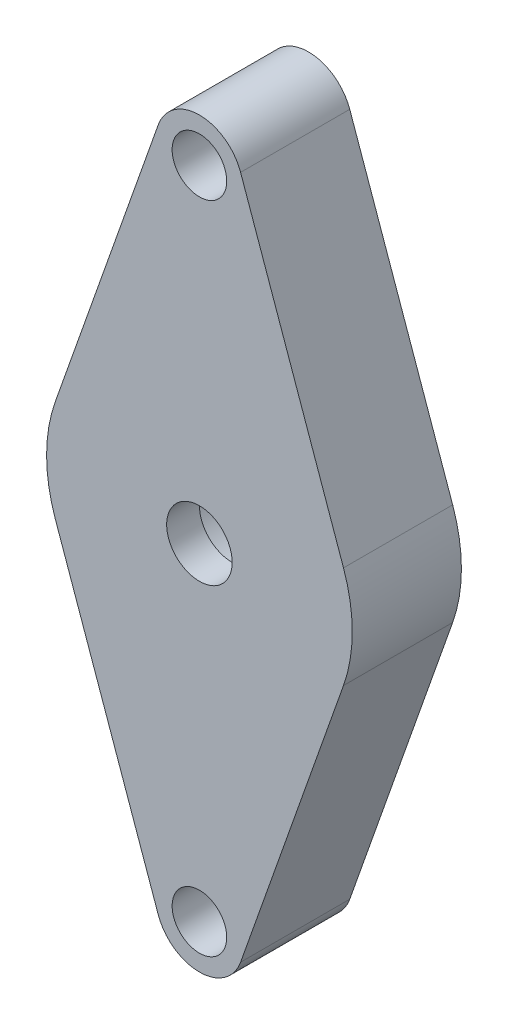
ISO-10303-21;
HEADER;
FILE_DESCRIPTION(('STEP AP214'),'2;1');
FILE_NAME('part.step','',(''),(''),'','','');
FILE_SCHEMA(('AUTOMOTIVE_DESIGN { 1 0 10303 214 1 1 1 1 }'));
ENDSEC;
DATA;
#1=APPLICATION_CONTEXT('core data for automotive mechanical design processes');
#2=APPLICATION_PROTOCOL_DEFINITION('international standard','automotive_design',2000,#1);
#3=PRODUCT_CONTEXT('',#1,'mechanical');
#4=PRODUCT('Part','Part','',(#3));
#5=PRODUCT_RELATED_PRODUCT_CATEGORY('part','',(#4));
#6=PRODUCT_DEFINITION_FORMATION('','',#4);
#7=PRODUCT_DEFINITION_CONTEXT('part definition',#1,'design');
#8=PRODUCT_DEFINITION('design','',#6,#7);
#9=PRODUCT_DEFINITION_SHAPE('','',#8);
#10=(LENGTH_UNIT() NAMED_UNIT(*) SI_UNIT(.MILLI.,.METRE.));
#11=(NAMED_UNIT(*) PLANE_ANGLE_UNIT() SI_UNIT($,.RADIAN.));
#12=(NAMED_UNIT(*) SI_UNIT($,.STERADIAN.) SOLID_ANGLE_UNIT());
#13=UNCERTAINTY_MEASURE_WITH_UNIT(LENGTH_MEASURE(1.E-05),#10,'distance_accuracy_value','');
#14=(GEOMETRIC_REPRESENTATION_CONTEXT(3) GLOBAL_UNCERTAINTY_ASSIGNED_CONTEXT((#13)) GLOBAL_UNIT_ASSIGNED_CONTEXT((#10,
#11,#12)) REPRESENTATION_CONTEXT('',''));
#15=CARTESIAN_POINT('',(0.,0.,0.));
#16=DIRECTION('',(0.,0.,1.));
#17=DIRECTION('',(1.,0.,0.));
#18=AXIS2_PLACEMENT_3D('',#15,#16,#17);
#19=CARTESIAN_POINT('',(0.,0.,5.));
#20=DIRECTION('',(0.,0.,-1.));
#21=DIRECTION('',(-1.,0.,0.));
#22=AXIS2_PLACEMENT_3D('',#19,#20,#21);
#23=CYLINDRICAL_SURFACE('',#22,3.);
#24=CARTESIAN_POINT('',(0.,0.,0.));
#25=DIRECTION('',(0.,0.,1.));
#26=DIRECTION('',(1.,0.,0.));
#27=AXIS2_PLACEMENT_3D('',#24,#25,#26);
#28=CIRCLE('',#27,3.);
#29=CARTESIAN_POINT('',(3.,0.,0.));
#30=VERTEX_POINT('',#29);
#31=EDGE_CURVE('E151',#30,#30,#28,.T.);
#32=ORIENTED_EDGE('',*,*,#31,.F.);
#33=EDGE_LOOP('',(#32));
#34=FACE_BOUND('',#33,.T.);
#35=CARTESIAN_POINT('',(0.,0.,3.5));
#36=DIRECTION('',(0.,0.,1.));
#37=DIRECTION('',(1.,0.,0.));
#38=AXIS2_PLACEMENT_3D('',#35,#36,#37);
#39=CIRCLE('',#38,3.);
#40=CARTESIAN_POINT('',(3.,0.,3.5));
#41=VERTEX_POINT('',#40);
#42=EDGE_CURVE('E230',#41,#41,#39,.T.);
#43=ORIENTED_EDGE('',*,*,#42,.T.);
#44=EDGE_LOOP('',(#43));
#45=FACE_BOUND('',#44,.T.);
#46=ADVANCED_FACE('F43',(#34,#45),#23,.F.);
#47=CARTESIAN_POINT('',(0.,0.,5.));
#48=DIRECTION('',(0.,0.,1.));
#49=DIRECTION('',(1.,0.,0.));
#50=AXIS2_PLACEMENT_3D('',#47,#48,#49);
#51=PLANE('',#50);
#52=CARTESIAN_POINT('',(0.,15.,5.));
#53=DIRECTION('',(0.,0.,1.));
#54=DIRECTION('',(1.,0.,0.));
#55=AXIS2_PLACEMENT_3D('',#52,#53,#54);
#56=CIRCLE('',#55,1.25);
#57=CARTESIAN_POINT('',(1.25,15.,5.));
#58=VERTEX_POINT('',#57);
#59=EDGE_CURVE('E217',#58,#58,#56,.T.);
#60=ORIENTED_EDGE('',*,*,#59,.F.);
#61=EDGE_LOOP('',(#60));
#62=FACE_BOUND('',#61,.T.);
#63=CARTESIAN_POINT('',(0.,0.,5.));
#64=DIRECTION('',(0.,0.,1.));
#65=DIRECTION('',(1.,0.,0.));
#66=AXIS2_PLACEMENT_3D('',#63,#64,#65);
#67=CIRCLE('',#66,7.);
#68=CARTESIAN_POINT('',(-6.59966329107444,2.33333333333333,5.));
#69=VERTEX_POINT('',#68);
#70=CARTESIAN_POINT('',(-6.59966329107444,-2.33333333333333,5.));
#71=VERTEX_POINT('',#70);
#72=EDGE_CURVE('E169',#69,#71,#67,.T.);
#73=ORIENTED_EDGE('',*,*,#72,.T.);
#74=DIRECTION('',(0.333333333333334,-0.942809041582063,0.));
#75=VECTOR('',#74,1.);
#76=CARTESIAN_POINT('',(-6.59966329107444,-2.33333333333333,5.));
#77=LINE('',#76,#75);
#78=CARTESIAN_POINT('',(-1.88561808316412,-15.6666666666667,5.));
#79=VERTEX_POINT('',#78);
#80=EDGE_CURVE('E104',#71,#79,#77,.T.);
#81=ORIENTED_EDGE('',*,*,#80,.T.);
#82=CARTESIAN_POINT('',(0.,-15.,5.));
#83=DIRECTION('',(0.,0.,1.));
#84=DIRECTION('',(-1.,0.,0.));
#85=AXIS2_PLACEMENT_3D('',#82,#83,#84);
#86=CIRCLE('',#85,2.);
#87=CARTESIAN_POINT('',(1.88561808316413,-15.6666666666667,5.));
#88=VERTEX_POINT('',#87);
#89=EDGE_CURVE('E190',#79,#88,#86,.T.);
#90=ORIENTED_EDGE('',*,*,#89,.T.);
#91=DIRECTION('',(0.333333333333333,0.942809041582063,0.));
#92=VECTOR('',#91,1.);
#93=CARTESIAN_POINT('',(1.88561808316413,-15.6666666666667,5.));
#94=LINE('',#93,#92);
#95=CARTESIAN_POINT('',(6.59966329107444,-2.33333333333333,5.));
#96=VERTEX_POINT('',#95);
#97=EDGE_CURVE('E204',#88,#96,#94,.T.);
#98=ORIENTED_EDGE('',*,*,#97,.T.);
#99=CARTESIAN_POINT('',(0.,0.,5.));
#100=DIRECTION('',(0.,0.,1.));
#101=DIRECTION('',(1.,0.,0.));
#102=AXIS2_PLACEMENT_3D('',#99,#100,#101);
#103=CIRCLE('',#102,7.);
#104=CARTESIAN_POINT('',(6.59966329107444,2.33333333333333,5.));
#105=VERTEX_POINT('',#104);
#106=EDGE_CURVE('E124',#96,#105,#103,.T.);
#107=ORIENTED_EDGE('',*,*,#106,.T.);
#108=DIRECTION('',(-0.333333333333333,0.942809041582063,0.));
#109=VECTOR('',#108,1.);
#110=CARTESIAN_POINT('',(1.88561808316413,15.6666666666667,5.));
#111=LINE('',#110,#109);
#112=CARTESIAN_POINT('',(1.88561808316413,15.6666666666667,5.));
#113=VERTEX_POINT('',#112);
#114=EDGE_CURVE('E117',#105,#113,#111,.T.);
#115=ORIENTED_EDGE('',*,*,#114,.T.);
#116=CARTESIAN_POINT('',(0.,15.,5.));
#117=DIRECTION('',(0.,0.,1.));
#118=DIRECTION('',(1.,0.,0.));
#119=AXIS2_PLACEMENT_3D('',#116,#117,#118);
#120=CIRCLE('',#119,2.);
#121=CARTESIAN_POINT('',(-1.88561808316413,15.6666666666667,5.));
#122=VERTEX_POINT('',#121);
#123=EDGE_CURVE('E122',#113,#122,#120,.T.);
#124=ORIENTED_EDGE('',*,*,#123,.T.);
#125=DIRECTION('',(-0.333333333333334,-0.942809041582063,0.));
#126=VECTOR('',#125,1.);
#127=CARTESIAN_POINT('',(-6.59966329107444,2.33333333333333,5.));
#128=LINE('',#127,#126);
#129=EDGE_CURVE('E61',#122,#69,#128,.T.);
#130=ORIENTED_EDGE('',*,*,#129,.T.);
#131=EDGE_LOOP('',(#73,#81,#90,#98,#107,#115,#124,#130));
#132=FACE_BOUND('',#131,.T.);
#133=CARTESIAN_POINT('',(0.,-15.,5.));
#134=DIRECTION('',(0.,0.,1.));
#135=DIRECTION('',(1.,0.,0.));
#136=AXIS2_PLACEMENT_3D('',#133,#134,#135);
#137=CIRCLE('',#136,1.25);
#138=CARTESIAN_POINT('',(1.25,-15.,5.));
#139=VERTEX_POINT('',#138);
#140=EDGE_CURVE('E222',#139,#139,#137,.T.);
#141=ORIENTED_EDGE('',*,*,#140,.F.);
#142=EDGE_LOOP('',(#141));
#143=FACE_BOUND('',#142,.T.);
#144=CARTESIAN_POINT('',(0.,0.,5.));
#145=DIRECTION('',(0.,0.,1.));
#146=DIRECTION('',(1.,0.,0.));
#147=AXIS2_PLACEMENT_3D('',#144,#145,#146);
#148=CIRCLE('',#147,1.5);
#149=CARTESIAN_POINT('',(1.5,0.,5.));
#150=VERTEX_POINT('',#149);
#151=EDGE_CURVE('E238',#150,#150,#148,.T.);
#152=ORIENTED_EDGE('',*,*,#151,.F.);
#153=EDGE_LOOP('',(#152));
#154=FACE_BOUND('',#153,.T.);
#155=ADVANCED_FACE('F119',(#62,#132,#143,#154),#51,.T.);
#156=CARTESIAN_POINT('',(0.,0.,0.));
#157=DIRECTION('',(0.,0.,1.));
#158=DIRECTION('',(1.,0.,0.));
#159=AXIS2_PLACEMENT_3D('',#156,#157,#158);
#160=PLANE('',#159);
#161=CARTESIAN_POINT('',(0.,0.,0.));
#162=DIRECTION('',(0.,0.,1.));
#163=DIRECTION('',(1.,0.,0.));
#164=AXIS2_PLACEMENT_3D('',#161,#162,#163);
#165=CIRCLE('',#164,7.);
#166=CARTESIAN_POINT('',(-6.59966329107444,2.33333333333333,0.));
#167=VERTEX_POINT('',#166);
#168=CARTESIAN_POINT('',(-6.59966329107444,-2.33333333333333,0.));
#169=VERTEX_POINT('',#168);
#170=EDGE_CURVE('E146',#167,#169,#165,.T.);
#171=ORIENTED_EDGE('',*,*,#170,.F.);
#172=DIRECTION('',(-0.333333333333334,-0.942809041582063,0.));
#173=VECTOR('',#172,1.);
#174=CARTESIAN_POINT('',(-6.59966329107444,2.33333333333333,0.));
#175=LINE('',#174,#173);
#176=CARTESIAN_POINT('',(-1.88561808316413,15.6666666666667,0.));
#177=VERTEX_POINT('',#176);
#178=EDGE_CURVE('E96',#177,#167,#175,.T.);
#179=ORIENTED_EDGE('',*,*,#178,.F.);
#180=CARTESIAN_POINT('',(0.,15.,0.));
#181=DIRECTION('',(0.,0.,1.));
#182=DIRECTION('',(1.,0.,0.));
#183=AXIS2_PLACEMENT_3D('',#180,#181,#182);
#184=CIRCLE('',#183,2.);
#185=CARTESIAN_POINT('',(1.88561808316413,15.6666666666667,0.));
#186=VERTEX_POINT('',#185);
#187=EDGE_CURVE('E90',#186,#177,#184,.T.);
#188=ORIENTED_EDGE('',*,*,#187,.F.);
#189=DIRECTION('',(-0.333333333333333,0.942809041582063,0.));
#190=VECTOR('',#189,1.);
#191=CARTESIAN_POINT('',(1.88561808316413,15.6666666666667,0.));
#192=LINE('',#191,#190);
#193=CARTESIAN_POINT('',(6.59966329107444,2.33333333333333,0.));
#194=VERTEX_POINT('',#193);
#195=EDGE_CURVE('E133',#194,#186,#192,.T.);
#196=ORIENTED_EDGE('',*,*,#195,.F.);
#197=CARTESIAN_POINT('',(0.,0.,0.));
#198=DIRECTION('',(0.,0.,1.));
#199=DIRECTION('',(1.,0.,0.));
#200=AXIS2_PLACEMENT_3D('',#197,#198,#199);
#201=CIRCLE('',#200,7.);
#202=CARTESIAN_POINT('',(6.59966329107444,-2.33333333333333,0.));
#203=VERTEX_POINT('',#202);
#204=EDGE_CURVE('E160',#203,#194,#201,.T.);
#205=ORIENTED_EDGE('',*,*,#204,.F.);
#206=DIRECTION('',(0.333333333333333,0.942809041582063,0.));
#207=VECTOR('',#206,1.);
#208=CARTESIAN_POINT('',(1.88561808316413,-15.6666666666667,0.));
#209=LINE('',#208,#207);
#210=CARTESIAN_POINT('',(1.88561808316413,-15.6666666666667,0.));
#211=VERTEX_POINT('',#210);
#212=EDGE_CURVE('E157',#211,#203,#209,.T.);
#213=ORIENTED_EDGE('',*,*,#212,.F.);
#214=CARTESIAN_POINT('',(0.,-15.,0.));
#215=DIRECTION('',(0.,0.,1.));
#216=DIRECTION('',(-1.,0.,0.));
#217=AXIS2_PLACEMENT_3D('',#214,#215,#216);
#218=CIRCLE('',#217,2.);
#219=CARTESIAN_POINT('',(-1.88561808316412,-15.6666666666667,0.));
#220=VERTEX_POINT('',#219);
#221=EDGE_CURVE('E154',#220,#211,#218,.T.);
#222=ORIENTED_EDGE('',*,*,#221,.F.);
#223=DIRECTION('',(0.333333333333334,-0.942809041582063,0.));
#224=VECTOR('',#223,1.);
#225=CARTESIAN_POINT('',(-6.59966329107444,-2.33333333333333,0.));
#226=LINE('',#225,#224);
#227=EDGE_CURVE('E150',#169,#220,#226,.T.);
#228=ORIENTED_EDGE('',*,*,#227,.F.);
#229=EDGE_LOOP('',(#171,#179,#188,#196,#205,#213,#222,#228));
#230=FACE_BOUND('',#229,.T.);
#231=ORIENTED_EDGE('',*,*,#31,.T.);
#232=EDGE_LOOP('',(#231));
#233=FACE_BOUND('',#232,.T.);
#234=CARTESIAN_POINT('',(0.,15.,0.));
#235=DIRECTION('',(0.,0.,1.));
#236=DIRECTION('',(1.,0.,0.));
#237=AXIS2_PLACEMENT_3D('',#234,#235,#236);
#238=CIRCLE('',#237,1.25);
#239=CARTESIAN_POINT('',(1.25,15.,0.));
#240=VERTEX_POINT('',#239);
#241=EDGE_CURVE('E218',#240,#240,#238,.T.);
#242=ORIENTED_EDGE('',*,*,#241,.T.);
#243=EDGE_LOOP('',(#242));
#244=FACE_BOUND('',#243,.T.);
#245=CARTESIAN_POINT('',(0.,-15.,0.));
#246=DIRECTION('',(0.,0.,1.));
#247=DIRECTION('',(1.,0.,0.));
#248=AXIS2_PLACEMENT_3D('',#245,#246,#247);
#249=CIRCLE('',#248,1.25);
#250=CARTESIAN_POINT('',(1.25,-15.,0.));
#251=VERTEX_POINT('',#250);
#252=EDGE_CURVE('E226',#251,#251,#249,.T.);
#253=ORIENTED_EDGE('',*,*,#252,.T.);
#254=EDGE_LOOP('',(#253));
#255=FACE_BOUND('',#254,.T.);
#256=ADVANCED_FACE('F194',(#230,#233,#244,#255),#160,.F.);
#257=CARTESIAN_POINT('',(0.,0.,5.));
#258=DIRECTION('',(0.,0.,-1.));
#259=DIRECTION('',(-1.,0.,0.));
#260=AXIS2_PLACEMENT_3D('',#257,#258,#259);
#261=CYLINDRICAL_SURFACE('',#260,7.);
#262=ORIENTED_EDGE('',*,*,#170,.T.);
#263=DIRECTION('',(0.,0.,-1.));
#264=VECTOR('',#263,1.);
#265=CARTESIAN_POINT('',(-6.59966329107444,-2.33333333333333,5.));
#266=LINE('',#265,#264);
#267=EDGE_CURVE('E11',#71,#169,#266,.T.);
#268=ORIENTED_EDGE('',*,*,#267,.F.);
#269=ORIENTED_EDGE('',*,*,#72,.F.);
#270=DIRECTION('',(0.,0.,-1.));
#271=VECTOR('',#270,1.);
#272=CARTESIAN_POINT('',(-6.59966329107444,2.33333333333333,5.));
#273=LINE('',#272,#271);
#274=EDGE_CURVE('E142',#69,#167,#273,.T.);
#275=ORIENTED_EDGE('',*,*,#274,.T.);
#276=EDGE_LOOP('',(#262,#268,#269,#275));
#277=FACE_BOUND('',#276,.T.);
#278=ADVANCED_FACE('F45',(#277),#261,.T.);
#279=CARTESIAN_POINT('',(-6.59966329107444,-2.33333333333333,5.));
#280=DIRECTION('',(0.942809041582063,0.333333333333334,0.));
#281=DIRECTION('',(-0.333333333333334,0.942809041582063,0.));
#282=AXIS2_PLACEMENT_3D('',#279,#280,#281);
#283=PLANE('',#282);
#284=ORIENTED_EDGE('',*,*,#227,.T.);
#285=DIRECTION('',(0.,0.,-1.));
#286=VECTOR('',#285,1.);
#287=CARTESIAN_POINT('',(-1.88561808316412,-15.6666666666667,5.));
#288=LINE('',#287,#286);
#289=EDGE_CURVE('E53',#79,#220,#288,.T.);
#290=ORIENTED_EDGE('',*,*,#289,.F.);
#291=ORIENTED_EDGE('',*,*,#80,.F.);
#292=ORIENTED_EDGE('',*,*,#267,.T.);
#293=EDGE_LOOP('',(#284,#290,#291,#292));
#294=FACE_BOUND('',#293,.T.);
#295=ADVANCED_FACE('F283',(#294),#283,.F.);
#296=CARTESIAN_POINT('',(0.,-15.,5.));
#297=DIRECTION('',(0.,0.,-1.));
#298=DIRECTION('',(-1.,0.,0.));
#299=AXIS2_PLACEMENT_3D('',#296,#297,#298);
#300=CYLINDRICAL_SURFACE('',#299,2.);
#301=ORIENTED_EDGE('',*,*,#221,.T.);
#302=DIRECTION('',(0.,0.,-1.));
#303=VECTOR('',#302,1.);
#304=CARTESIAN_POINT('',(1.88561808316413,-15.6666666666667,5.));
#305=LINE('',#304,#303);
#306=EDGE_CURVE('E180',#88,#211,#305,.T.);
#307=ORIENTED_EDGE('',*,*,#306,.F.);
#308=ORIENTED_EDGE('',*,*,#89,.F.);
#309=ORIENTED_EDGE('',*,*,#289,.T.);
#310=EDGE_LOOP('',(#301,#307,#308,#309));
#311=FACE_BOUND('',#310,.T.);
#312=ADVANCED_FACE('F188',(#311),#300,.T.);
#313=CARTESIAN_POINT('',(1.88561808316413,-15.6666666666667,5.));
#314=DIRECTION('',(-0.942809041582063,0.333333333333333,0.));
#315=DIRECTION('',(-0.333333333333333,-0.942809041582063,0.));
#316=AXIS2_PLACEMENT_3D('',#313,#314,#315);
#317=PLANE('',#316);
#318=ORIENTED_EDGE('',*,*,#212,.T.);
#319=DIRECTION('',(0.,0.,-1.));
#320=VECTOR('',#319,1.);
#321=CARTESIAN_POINT('',(6.59966329107444,-2.33333333333333,5.));
#322=LINE('',#321,#320);
#323=EDGE_CURVE('E176',#96,#203,#322,.T.);
#324=ORIENTED_EDGE('',*,*,#323,.F.);
#325=ORIENTED_EDGE('',*,*,#97,.F.);
#326=ORIENTED_EDGE('',*,*,#306,.T.);
#327=EDGE_LOOP('',(#318,#324,#325,#326));
#328=FACE_BOUND('',#327,.T.);
#329=ADVANCED_FACE('F199',(#328),#317,.F.);
#330=CARTESIAN_POINT('',(0.,0.,5.));
#331=DIRECTION('',(0.,0.,-1.));
#332=DIRECTION('',(-1.,0.,0.));
#333=AXIS2_PLACEMENT_3D('',#330,#331,#332);
#334=CYLINDRICAL_SURFACE('',#333,7.);
#335=ORIENTED_EDGE('',*,*,#204,.T.);
#336=DIRECTION('',(0.,0.,-1.));
#337=VECTOR('',#336,1.);
#338=CARTESIAN_POINT('',(6.59966329107444,2.33333333333333,5.));
#339=LINE('',#338,#337);
#340=EDGE_CURVE('E135',#105,#194,#339,.T.);
#341=ORIENTED_EDGE('',*,*,#340,.F.);
#342=ORIENTED_EDGE('',*,*,#106,.F.);
#343=ORIENTED_EDGE('',*,*,#323,.T.);
#344=EDGE_LOOP('',(#335,#341,#342,#343));
#345=FACE_BOUND('',#344,.T.);
#346=ADVANCED_FACE('F202',(#345),#334,.T.);
#347=CARTESIAN_POINT('',(1.88561808316413,15.6666666666667,5.));
#348=DIRECTION('',(-0.942809041582063,-0.333333333333333,0.));
#349=DIRECTION('',(0.333333333333333,-0.942809041582063,0.));
#350=AXIS2_PLACEMENT_3D('',#347,#348,#349);
#351=PLANE('',#350);
#352=ORIENTED_EDGE('',*,*,#195,.T.);
#353=DIRECTION('',(0.,0.,-1.));
#354=VECTOR('',#353,1.);
#355=CARTESIAN_POINT('',(1.88561808316413,15.6666666666667,5.));
#356=LINE('',#355,#354);
#357=EDGE_CURVE('E130',#113,#186,#356,.T.);
#358=ORIENTED_EDGE('',*,*,#357,.F.);
#359=ORIENTED_EDGE('',*,*,#114,.F.);
#360=ORIENTED_EDGE('',*,*,#340,.T.);
#361=EDGE_LOOP('',(#352,#358,#359,#360));
#362=FACE_BOUND('',#361,.T.);
#363=ADVANCED_FACE('F131',(#362),#351,.F.);
#364=CARTESIAN_POINT('',(0.,15.,5.));
#365=DIRECTION('',(0.,0.,-1.));
#366=DIRECTION('',(-1.,0.,0.));
#367=AXIS2_PLACEMENT_3D('',#364,#365,#366);
#368=CYLINDRICAL_SURFACE('',#367,2.);
#369=ORIENTED_EDGE('',*,*,#187,.T.);
#370=DIRECTION('',(0.,0.,-1.));
#371=VECTOR('',#370,1.);
#372=CARTESIAN_POINT('',(-1.88561808316413,15.6666666666667,5.));
#373=LINE('',#372,#371);
#374=EDGE_CURVE('E136',#122,#177,#373,.T.);
#375=ORIENTED_EDGE('',*,*,#374,.F.);
#376=ORIENTED_EDGE('',*,*,#123,.F.);
#377=ORIENTED_EDGE('',*,*,#357,.T.);
#378=EDGE_LOOP('',(#369,#375,#376,#377));
#379=FACE_BOUND('',#378,.T.);
#380=ADVANCED_FACE('F138',(#379),#368,.T.);
#381=CARTESIAN_POINT('',(-6.59966329107444,2.33333333333333,5.));
#382=DIRECTION('',(0.942809041582063,-0.333333333333334,0.));
#383=DIRECTION('',(0.333333333333334,0.942809041582063,0.));
#384=AXIS2_PLACEMENT_3D('',#381,#382,#383);
#385=PLANE('',#384);
#386=ORIENTED_EDGE('',*,*,#178,.T.);
#387=ORIENTED_EDGE('',*,*,#274,.F.);
#388=ORIENTED_EDGE('',*,*,#129,.F.);
#389=ORIENTED_EDGE('',*,*,#374,.T.);
#390=EDGE_LOOP('',(#386,#387,#388,#389));
#391=FACE_BOUND('',#390,.T.);
#392=ADVANCED_FACE('F270',(#391),#385,.F.);
#393=CARTESIAN_POINT('',(0.,15.,5.));
#394=DIRECTION('',(0.,0.,-1.));
#395=DIRECTION('',(-1.,0.,0.));
#396=AXIS2_PLACEMENT_3D('',#393,#394,#395);
#397=CYLINDRICAL_SURFACE('',#396,1.25);
#398=ORIENTED_EDGE('',*,*,#59,.T.);
#399=EDGE_LOOP('',(#398));
#400=FACE_BOUND('',#399,.T.);
#401=ORIENTED_EDGE('',*,*,#241,.F.);
#402=EDGE_LOOP('',(#401));
#403=FACE_BOUND('',#402,.T.);
#404=ADVANCED_FACE('F273',(#400,#403),#397,.F.);
#405=CARTESIAN_POINT('',(0.,-15.,5.));
#406=DIRECTION('',(0.,0.,-1.));
#407=DIRECTION('',(-1.,0.,0.));
#408=AXIS2_PLACEMENT_3D('',#405,#406,#407);
#409=CYLINDRICAL_SURFACE('',#408,1.25);
#410=ORIENTED_EDGE('',*,*,#140,.T.);
#411=EDGE_LOOP('',(#410));
#412=FACE_BOUND('',#411,.T.);
#413=ORIENTED_EDGE('',*,*,#252,.F.);
#414=EDGE_LOOP('',(#413));
#415=FACE_BOUND('',#414,.T.);
#416=ADVANCED_FACE('F367',(#412,#415),#409,.F.);
#417=CARTESIAN_POINT('',(0.,0.,3.5));
#418=DIRECTION('',(0.,0.,1.));
#419=DIRECTION('',(1.,0.,0.));
#420=AXIS2_PLACEMENT_3D('',#417,#418,#419);
#421=PLANE('',#420);
#422=CARTESIAN_POINT('',(0.,0.,3.5));
#423=DIRECTION('',(0.,0.,1.));
#424=DIRECTION('',(1.,0.,0.));
#425=AXIS2_PLACEMENT_3D('',#422,#423,#424);
#426=CIRCLE('',#425,1.5);
#427=CARTESIAN_POINT('',(1.5,0.,3.5));
#428=VERTEX_POINT('',#427);
#429=EDGE_CURVE('E237',#428,#428,#426,.T.);
#430=ORIENTED_EDGE('',*,*,#429,.T.);
#431=EDGE_LOOP('',(#430));
#432=FACE_BOUND('',#431,.T.);
#433=ORIENTED_EDGE('',*,*,#42,.F.);
#434=EDGE_LOOP('',(#433));
#435=FACE_BOUND('',#434,.T.);
#436=ADVANCED_FACE('F246',(#432,#435),#421,.F.);
#437=CARTESIAN_POINT('',(0.,0.,3.5));
#438=DIRECTION('',(0.,0.,1.));
#439=DIRECTION('',(1.,0.,0.));
#440=AXIS2_PLACEMENT_3D('',#437,#438,#439);
#441=CYLINDRICAL_SURFACE('',#440,1.5);
#442=ORIENTED_EDGE('',*,*,#429,.F.);
#443=EDGE_LOOP('',(#442));
#444=FACE_BOUND('',#443,.T.);
#445=ORIENTED_EDGE('',*,*,#151,.T.);
#446=EDGE_LOOP('',(#445));
#447=FACE_BOUND('',#446,.T.);
#448=ADVANCED_FACE('F249',(#444,#447),#441,.F.);
#449=CLOSED_SHELL('',(#46,#155,#256,#278,#295,#312,#329,#346,#363,#380,#392,#404,#416,#436,#448));
#450=MANIFOLD_SOLID_BREP('B2',#449);
#451=ADVANCED_BREP_SHAPE_REPRESENTATION('',(#18,#450),#14);
#452=SHAPE_DEFINITION_REPRESENTATION(#9,#451);
ENDSEC;
END-ISO-10303-21;
